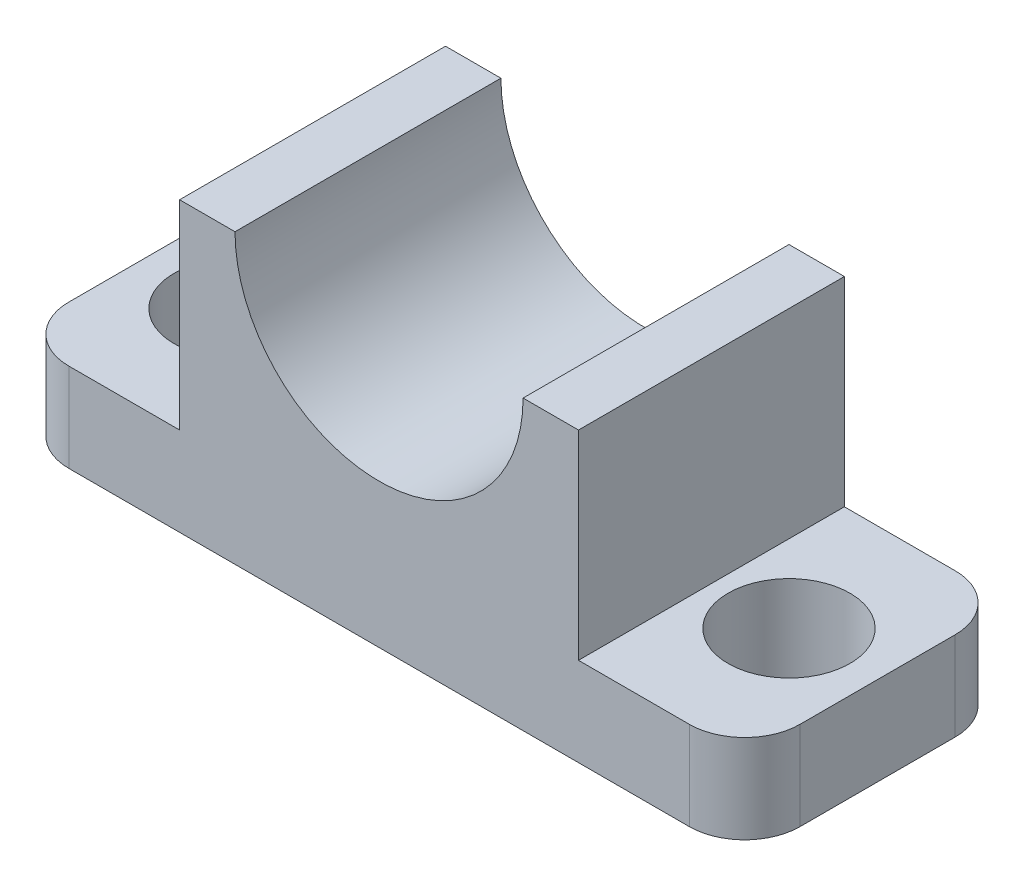
ISO-10303-21;
HEADER;
FILE_DESCRIPTION(('STEP AP214'),'2;1');
FILE_NAME('part.step','',(''),(''),'','','');
FILE_SCHEMA(('AUTOMOTIVE_DESIGN { 1 0 10303 214 1 1 1 1 }'));
ENDSEC;
DATA;
#1=APPLICATION_CONTEXT('core data for automotive mechanical design processes');
#2=APPLICATION_PROTOCOL_DEFINITION('international standard','automotive_design',2000,#1);
#3=PRODUCT_CONTEXT('',#1,'mechanical');
#4=PRODUCT('Part','Part','',(#3));
#5=PRODUCT_RELATED_PRODUCT_CATEGORY('part','',(#4));
#6=PRODUCT_DEFINITION_FORMATION('','',#4);
#7=PRODUCT_DEFINITION_CONTEXT('part definition',#1,'design');
#8=PRODUCT_DEFINITION('design','',#6,#7);
#9=PRODUCT_DEFINITION_SHAPE('','',#8);
#10=(LENGTH_UNIT() NAMED_UNIT(*) SI_UNIT(.MILLI.,.METRE.));
#11=(NAMED_UNIT(*) PLANE_ANGLE_UNIT() SI_UNIT($,.RADIAN.));
#12=(NAMED_UNIT(*) SI_UNIT($,.STERADIAN.) SOLID_ANGLE_UNIT());
#13=UNCERTAINTY_MEASURE_WITH_UNIT(LENGTH_MEASURE(1.E-05),#10,'distance_accuracy_value','');
#14=(GEOMETRIC_REPRESENTATION_CONTEXT(3) GLOBAL_UNCERTAINTY_ASSIGNED_CONTEXT((#13)) GLOBAL_UNIT_ASSIGNED_CONTEXT((#10,
#11,#12)) REPRESENTATION_CONTEXT('',''));
#15=CARTESIAN_POINT('',(0.,0.,0.));
#16=DIRECTION('',(0.,0.,1.));
#17=DIRECTION('',(1.,0.,0.));
#18=AXIS2_PLACEMENT_3D('',#15,#16,#17);
#19=CARTESIAN_POINT('',(18.,26.,12.));
#20=DIRECTION('',(0.,-1.,0.));
#21=DIRECTION('',(0.,0.,-1.));
#22=AXIS2_PLACEMENT_3D('',#19,#20,#21);
#23=PLANE('',#22);
#24=DIRECTION('',(-1.,0.,0.));
#25=VECTOR('',#24,1.);
#26=CARTESIAN_POINT('',(18.,26.,-12.));
#27=LINE('',#26,#25);
#28=CARTESIAN_POINT('',(18.,26.,-12.));
#29=VERTEX_POINT('',#28);
#30=CARTESIAN_POINT('',(13.,26.,-12.));
#31=VERTEX_POINT('',#30);
#32=EDGE_CURVE('E172',#29,#31,#27,.T.);
#33=ORIENTED_EDGE('',*,*,#32,.T.);
#34=DIRECTION('',(0.,0.,-1.));
#35=VECTOR('',#34,1.);
#36=CARTESIAN_POINT('',(13.,26.,12.));
#37=LINE('',#36,#35);
#38=CARTESIAN_POINT('',(13.,26.,12.));
#39=VERTEX_POINT('',#38);
#40=EDGE_CURVE('E150',#39,#31,#37,.T.);
#41=ORIENTED_EDGE('',*,*,#40,.F.);
#42=DIRECTION('',(-1.,0.,0.));
#43=VECTOR('',#42,1.);
#44=CARTESIAN_POINT('',(18.,26.,12.));
#45=LINE('',#44,#43);
#46=CARTESIAN_POINT('',(18.,26.,12.));
#47=VERTEX_POINT('',#46);
#48=EDGE_CURVE('E158',#47,#39,#45,.T.);
#49=ORIENTED_EDGE('',*,*,#48,.F.);
#50=DIRECTION('',(0.,0.,-1.));
#51=VECTOR('',#50,1.);
#52=CARTESIAN_POINT('',(18.,26.,12.));
#53=LINE('',#52,#51);
#54=EDGE_CURVE('E243',#47,#29,#53,.T.);
#55=ORIENTED_EDGE('',*,*,#54,.T.);
#56=EDGE_LOOP('',(#33,#41,#49,#55));
#57=FACE_BOUND('',#56,.T.);
#58=ADVANCED_FACE('F45',(#57),#23,.F.);
#59=CARTESIAN_POINT('',(0.,26.,12.));
#60=DIRECTION('',(0.,0.,-1.));
#61=DIRECTION('',(-1.,0.,0.));
#62=AXIS2_PLACEMENT_3D('',#59,#60,#61);
#63=CYLINDRICAL_SURFACE('',#62,13.);
#64=CARTESIAN_POINT('',(0.,26.,-12.));
#65=DIRECTION('',(0.,0.,-1.));
#66=DIRECTION('',(1.,0.,0.));
#67=AXIS2_PLACEMENT_3D('',#64,#65,#66);
#68=CIRCLE('',#67,13.);
#69=CARTESIAN_POINT('',(-13.,26.,-12.));
#70=VERTEX_POINT('',#69);
#71=EDGE_CURVE('E282',#31,#70,#68,.T.);
#72=ORIENTED_EDGE('',*,*,#71,.T.);
#73=DIRECTION('',(0.,0.,-1.));
#74=VECTOR('',#73,1.);
#75=CARTESIAN_POINT('',(-13.,26.,12.));
#76=LINE('',#75,#74);
#77=CARTESIAN_POINT('',(-13.,26.,12.));
#78=VERTEX_POINT('',#77);
#79=EDGE_CURVE('E153',#78,#70,#76,.T.);
#80=ORIENTED_EDGE('',*,*,#79,.F.);
#81=CARTESIAN_POINT('',(0.,26.,12.));
#82=DIRECTION('',(0.,0.,-1.));
#83=DIRECTION('',(1.,0.,0.));
#84=AXIS2_PLACEMENT_3D('',#81,#82,#83);
#85=CIRCLE('',#84,13.);
#86=EDGE_CURVE('E146',#39,#78,#85,.T.);
#87=ORIENTED_EDGE('',*,*,#86,.F.);
#88=ORIENTED_EDGE('',*,*,#40,.T.);
#89=EDGE_LOOP('',(#72,#80,#87,#88));
#90=FACE_BOUND('',#89,.T.);
#91=ADVANCED_FACE('F148',(#90),#63,.F.);
#92=CARTESIAN_POINT('',(-18.,26.,12.));
#93=DIRECTION('',(0.,-1.,0.));
#94=DIRECTION('',(0.,0.,-1.));
#95=AXIS2_PLACEMENT_3D('',#92,#93,#94);
#96=PLANE('',#95);
#97=DIRECTION('',(-1.,0.,0.));
#98=VECTOR('',#97,1.);
#99=CARTESIAN_POINT('',(-18.,26.,-12.));
#100=LINE('',#99,#98);
#101=CARTESIAN_POINT('',(-18.,26.,-12.));
#102=VERTEX_POINT('',#101);
#103=EDGE_CURVE('E273',#70,#102,#100,.T.);
#104=ORIENTED_EDGE('',*,*,#103,.T.);
#105=DIRECTION('',(0.,0.,-1.));
#106=VECTOR('',#105,1.);
#107=CARTESIAN_POINT('',(-18.,26.,12.));
#108=LINE('',#107,#106);
#109=CARTESIAN_POINT('',(-18.,26.,12.));
#110=VERTEX_POINT('',#109);
#111=EDGE_CURVE('E181',#110,#102,#108,.T.);
#112=ORIENTED_EDGE('',*,*,#111,.F.);
#113=DIRECTION('',(-1.,0.,0.));
#114=VECTOR('',#113,1.);
#115=CARTESIAN_POINT('',(-18.,26.,12.));
#116=LINE('',#115,#114);
#117=EDGE_CURVE('E157',#78,#110,#116,.T.);
#118=ORIENTED_EDGE('',*,*,#117,.F.);
#119=ORIENTED_EDGE('',*,*,#79,.T.);
#120=EDGE_LOOP('',(#104,#112,#118,#119));
#121=FACE_BOUND('',#120,.T.);
#122=ADVANCED_FACE('F305',(#121),#96,.F.);
#123=CARTESIAN_POINT('',(-18.,8.,12.));
#124=DIRECTION('',(1.,0.,0.));
#125=DIRECTION('',(0.,0.,-1.));
#126=AXIS2_PLACEMENT_3D('',#123,#124,#125);
#127=PLANE('',#126);
#128=DIRECTION('',(0.,-1.,0.));
#129=VECTOR('',#128,1.);
#130=CARTESIAN_POINT('',(-18.,8.,-12.));
#131=LINE('',#130,#129);
#132=CARTESIAN_POINT('',(-18.,8.,-12.));
#133=VERTEX_POINT('',#132);
#134=EDGE_CURVE('E265',#102,#133,#131,.T.);
#135=ORIENTED_EDGE('',*,*,#134,.T.);
#136=DIRECTION('',(0.,0.,-1.));
#137=VECTOR('',#136,1.);
#138=CARTESIAN_POINT('',(-18.,8.,12.));
#139=LINE('',#138,#137);
#140=CARTESIAN_POINT('',(-18.,8.,12.));
#141=VERTEX_POINT('',#140);
#142=EDGE_CURVE('E254',#141,#133,#139,.T.);
#143=ORIENTED_EDGE('',*,*,#142,.F.);
#144=DIRECTION('',(0.,-1.,0.));
#145=VECTOR('',#144,1.);
#146=CARTESIAN_POINT('',(-18.,8.,12.));
#147=LINE('',#146,#145);
#148=EDGE_CURVE('E266',#110,#141,#147,.T.);
#149=ORIENTED_EDGE('',*,*,#148,.F.);
#150=ORIENTED_EDGE('',*,*,#111,.T.);
#151=EDGE_LOOP('',(#135,#143,#149,#150));
#152=FACE_BOUND('',#151,.T.);
#153=ADVANCED_FACE('F263',(#152),#127,.F.);
#154=CARTESIAN_POINT('',(-33.,8.,12.));
#155=DIRECTION('',(0.,-1.,0.));
#156=DIRECTION('',(1.,0.,0.));
#157=AXIS2_PLACEMENT_3D('',#154,#155,#156);
#158=PLANE('',#157);
#159=CARTESIAN_POINT('',(-25.,7.99999999999999,0.));
#160=DIRECTION('',(0.,1.,0.));
#161=DIRECTION('',(1.,0.,0.));
#162=AXIS2_PLACEMENT_3D('',#159,#160,#161);
#163=CIRCLE('',#162,5.5);
#164=CARTESIAN_POINT('',(-19.5,7.99999999999999,0.));
#165=VERTEX_POINT('',#164);
#166=EDGE_CURVE('E487',#165,#165,#163,.T.);
#167=ORIENTED_EDGE('',*,*,#166,.F.);
#168=EDGE_LOOP('',(#167));
#169=FACE_BOUND('',#168,.T.);
#170=DIRECTION('',(0.,0.,-1.));
#171=VECTOR('',#170,1.);
#172=CARTESIAN_POINT('',(-33.,8.,12.));
#173=LINE('',#172,#171);
#174=CARTESIAN_POINT('',(-33.,8.,7.));
#175=VERTEX_POINT('',#174);
#176=CARTESIAN_POINT('',(-33.,8.,-7.));
#177=VERTEX_POINT('',#176);
#178=EDGE_CURVE('E250',#175,#177,#173,.T.);
#179=ORIENTED_EDGE('',*,*,#178,.F.);
#180=CARTESIAN_POINT('',(-28.,8.,7.));
#181=DIRECTION('',(0.,-1.,0.));
#182=DIRECTION('',(1.,0.,0.));
#183=AXIS2_PLACEMENT_3D('',#180,#181,#182);
#184=CIRCLE('',#183,5.);
#185=CARTESIAN_POINT('',(-28.,8.,12.));
#186=VERTEX_POINT('',#185);
#187=EDGE_CURVE('E210',#175,#186,#184,.F.);
#188=ORIENTED_EDGE('',*,*,#187,.T.);
#189=DIRECTION('',(-1.,0.,0.));
#190=VECTOR('',#189,1.);
#191=CARTESIAN_POINT('',(-33.,8.,12.));
#192=LINE('',#191,#190);
#193=EDGE_CURVE('E309',#141,#186,#192,.T.);
#194=ORIENTED_EDGE('',*,*,#193,.F.);
#195=ORIENTED_EDGE('',*,*,#142,.T.);
#196=DIRECTION('',(-1.,0.,0.));
#197=VECTOR('',#196,1.);
#198=CARTESIAN_POINT('',(-33.,8.,-12.));
#199=LINE('',#198,#197);
#200=CARTESIAN_POINT('',(-28.,8.,-12.));
#201=VERTEX_POINT('',#200);
#202=EDGE_CURVE('E275',#133,#201,#199,.T.);
#203=ORIENTED_EDGE('',*,*,#202,.T.);
#204=CARTESIAN_POINT('',(-28.,8.,-7.));
#205=DIRECTION('',(0.,-1.,0.));
#206=DIRECTION('',(1.,0.,0.));
#207=AXIS2_PLACEMENT_3D('',#204,#205,#206);
#208=CIRCLE('',#207,5.);
#209=EDGE_CURVE('E207',#201,#177,#208,.F.);
#210=ORIENTED_EDGE('',*,*,#209,.T.);
#211=EDGE_LOOP('',(#179,#188,#194,#195,#203,#210));
#212=FACE_BOUND('',#211,.T.);
#213=ADVANCED_FACE('F448',(#169,#212),#158,.F.);
#214=CARTESIAN_POINT('',(-33.,0.,12.));
#215=DIRECTION('',(1.,0.,0.));
#216=DIRECTION('',(0.,0.,-1.));
#217=AXIS2_PLACEMENT_3D('',#214,#215,#216);
#218=PLANE('',#217);
#219=DIRECTION('',(0.,0.,-1.));
#220=VECTOR('',#219,1.);
#221=CARTESIAN_POINT('',(-33.,0.,12.));
#222=LINE('',#221,#220);
#223=CARTESIAN_POINT('',(-33.,0.,7.));
#224=VERTEX_POINT('',#223);
#225=CARTESIAN_POINT('',(-33.,0.,-7.));
#226=VERTEX_POINT('',#225);
#227=EDGE_CURVE('E240',#224,#226,#222,.T.);
#228=ORIENTED_EDGE('',*,*,#227,.F.);
#229=DIRECTION('',(0.,-1.,0.));
#230=VECTOR('',#229,1.);
#231=CARTESIAN_POINT('',(-33.,8.,7.));
#232=LINE('',#231,#230);
#233=EDGE_CURVE('E204',#224,#175,#232,.F.);
#234=ORIENTED_EDGE('',*,*,#233,.T.);
#235=ORIENTED_EDGE('',*,*,#178,.T.);
#236=DIRECTION('',(0.,-1.,0.));
#237=VECTOR('',#236,1.);
#238=CARTESIAN_POINT('',(-33.,0.,-7.));
#239=LINE('',#238,#237);
#240=EDGE_CURVE('E200',#177,#226,#239,.T.);
#241=ORIENTED_EDGE('',*,*,#240,.T.);
#242=EDGE_LOOP('',(#228,#234,#235,#241));
#243=FACE_BOUND('',#242,.T.);
#244=ADVANCED_FACE('F438',(#243),#218,.F.);
#245=CARTESIAN_POINT('',(-33.,0.,12.));
#246=DIRECTION('',(0.,1.,0.));
#247=DIRECTION('',(0.,0.,1.));
#248=AXIS2_PLACEMENT_3D('',#245,#246,#247);
#249=PLANE('',#248);
#250=CARTESIAN_POINT('',(25.,0.,0.));
#251=DIRECTION('',(0.,1.,0.));
#252=DIRECTION('',(-1.,0.,0.));
#253=AXIS2_PLACEMENT_3D('',#250,#251,#252);
#254=CIRCLE('',#253,5.5);
#255=CARTESIAN_POINT('',(19.5,0.,0.));
#256=VERTEX_POINT('',#255);
#257=EDGE_CURVE('E303',#256,#256,#254,.T.);
#258=ORIENTED_EDGE('',*,*,#257,.T.);
#259=EDGE_LOOP('',(#258));
#260=FACE_BOUND('',#259,.T.);
#261=CARTESIAN_POINT('',(-25.,0.,0.));
#262=DIRECTION('',(0.,1.,0.));
#263=DIRECTION('',(1.,0.,0.));
#264=AXIS2_PLACEMENT_3D('',#261,#262,#263);
#265=CIRCLE('',#264,5.5);
#266=CARTESIAN_POINT('',(-19.5,0.,0.));
#267=VERTEX_POINT('',#266);
#268=EDGE_CURVE('E498',#267,#267,#265,.T.);
#269=ORIENTED_EDGE('',*,*,#268,.T.);
#270=EDGE_LOOP('',(#269));
#271=FACE_BOUND('',#270,.T.);
#272=DIRECTION('',(1.,0.,0.));
#273=VECTOR('',#272,1.);
#274=CARTESIAN_POINT('',(-33.,0.,12.));
#275=LINE('',#274,#273);
#276=CARTESIAN_POINT('',(-28.,0.,12.));
#277=VERTEX_POINT('',#276);
#278=CARTESIAN_POINT('',(28.,0.,12.));
#279=VERTEX_POINT('',#278);
#280=EDGE_CURVE('E298',#277,#279,#275,.T.);
#281=ORIENTED_EDGE('',*,*,#280,.F.);
#282=CARTESIAN_POINT('',(-28.,0.,7.));
#283=DIRECTION('',(0.,1.,0.));
#284=DIRECTION('',(0.,0.,1.));
#285=AXIS2_PLACEMENT_3D('',#282,#283,#284);
#286=CIRCLE('',#285,5.);
#287=EDGE_CURVE('E197',#277,#224,#286,.F.);
#288=ORIENTED_EDGE('',*,*,#287,.T.);
#289=ORIENTED_EDGE('',*,*,#227,.T.);
#290=CARTESIAN_POINT('',(-28.,0.,-7.));
#291=DIRECTION('',(0.,1.,0.));
#292=DIRECTION('',(0.,0.,1.));
#293=AXIS2_PLACEMENT_3D('',#290,#291,#292);
#294=CIRCLE('',#293,5.);
#295=CARTESIAN_POINT('',(-28.,0.,-12.));
#296=VERTEX_POINT('',#295);
#297=EDGE_CURVE('E194',#226,#296,#294,.F.);
#298=ORIENTED_EDGE('',*,*,#297,.T.);
#299=DIRECTION('',(1.,0.,0.));
#300=VECTOR('',#299,1.);
#301=CARTESIAN_POINT('',(-33.,0.,-12.));
#302=LINE('',#301,#300);
#303=CARTESIAN_POINT('',(28.,0.,-12.));
#304=VERTEX_POINT('',#303);
#305=EDGE_CURVE('E280',#296,#304,#302,.T.);
#306=ORIENTED_EDGE('',*,*,#305,.T.);
#307=CARTESIAN_POINT('',(28.,0.,-7.));
#308=DIRECTION('',(0.,1.,0.));
#309=DIRECTION('',(0.,0.,1.));
#310=AXIS2_PLACEMENT_3D('',#307,#308,#309);
#311=CIRCLE('',#310,5.);
#312=CARTESIAN_POINT('',(33.,0.,-7.));
#313=VERTEX_POINT('',#312);
#314=EDGE_CURVE('E191',#304,#313,#311,.F.);
#315=ORIENTED_EDGE('',*,*,#314,.T.);
#316=DIRECTION('',(0.,0.,-1.));
#317=VECTOR('',#316,1.);
#318=CARTESIAN_POINT('',(33.,0.,12.));
#319=LINE('',#318,#317);
#320=CARTESIAN_POINT('',(33.,0.,7.));
#321=VERTEX_POINT('',#320);
#322=EDGE_CURVE('E231',#321,#313,#319,.T.);
#323=ORIENTED_EDGE('',*,*,#322,.F.);
#324=CARTESIAN_POINT('',(28.,0.,7.));
#325=DIRECTION('',(0.,1.,0.));
#326=DIRECTION('',(0.,0.,1.));
#327=AXIS2_PLACEMENT_3D('',#324,#325,#326);
#328=CIRCLE('',#327,5.);
#329=EDGE_CURVE('E188',#321,#279,#328,.F.);
#330=ORIENTED_EDGE('',*,*,#329,.T.);
#331=EDGE_LOOP('',(#281,#288,#289,#298,#306,#315,#323,#330));
#332=FACE_BOUND('',#331,.T.);
#333=ADVANCED_FACE('F321',(#260,#271,#332),#249,.F.);
#334=CARTESIAN_POINT('',(33.,0.,12.));
#335=DIRECTION('',(-1.,0.,0.));
#336=DIRECTION('',(0.,0.,1.));
#337=AXIS2_PLACEMENT_3D('',#334,#335,#336);
#338=PLANE('',#337);
#339=ORIENTED_EDGE('',*,*,#322,.T.);
#340=DIRECTION('',(0.,1.,0.));
#341=VECTOR('',#340,1.);
#342=CARTESIAN_POINT('',(33.,0.,-7.));
#343=LINE('',#342,#341);
#344=CARTESIAN_POINT('',(33.,8.,-7.));
#345=VERTEX_POINT('',#344);
#346=EDGE_CURVE('E222',#313,#345,#343,.T.);
#347=ORIENTED_EDGE('',*,*,#346,.T.);
#348=DIRECTION('',(0.,0.,-1.));
#349=VECTOR('',#348,1.);
#350=CARTESIAN_POINT('',(33.,8.,12.));
#351=LINE('',#350,#349);
#352=CARTESIAN_POINT('',(33.,8.,7.));
#353=VERTEX_POINT('',#352);
#354=EDGE_CURVE('E228',#353,#345,#351,.T.);
#355=ORIENTED_EDGE('',*,*,#354,.F.);
#356=DIRECTION('',(0.,1.,0.));
#357=VECTOR('',#356,1.);
#358=CARTESIAN_POINT('',(33.,0.,7.));
#359=LINE('',#358,#357);
#360=EDGE_CURVE('E219',#353,#321,#359,.F.);
#361=ORIENTED_EDGE('',*,*,#360,.T.);
#362=EDGE_LOOP('',(#339,#347,#355,#361));
#363=FACE_BOUND('',#362,.T.);
#364=ADVANCED_FACE('F227',(#363),#338,.F.);
#365=CARTESIAN_POINT('',(33.,8.,12.));
#366=DIRECTION('',(0.,-1.,0.));
#367=DIRECTION('',(1.,0.,0.));
#368=AXIS2_PLACEMENT_3D('',#365,#366,#367);
#369=PLANE('',#368);
#370=CARTESIAN_POINT('',(25.,8.,0.));
#371=DIRECTION('',(0.,1.,0.));
#372=DIRECTION('',(-1.,0.,0.));
#373=AXIS2_PLACEMENT_3D('',#370,#371,#372);
#374=CIRCLE('',#373,5.5);
#375=CARTESIAN_POINT('',(19.5,8.,0.));
#376=VERTEX_POINT('',#375);
#377=EDGE_CURVE('E497',#376,#376,#374,.T.);
#378=ORIENTED_EDGE('',*,*,#377,.F.);
#379=EDGE_LOOP('',(#378));
#380=FACE_BOUND('',#379,.T.);
#381=ORIENTED_EDGE('',*,*,#354,.T.);
#382=CARTESIAN_POINT('',(28.,8.,-7.));
#383=DIRECTION('',(0.,-1.,0.));
#384=DIRECTION('',(1.,0.,0.));
#385=AXIS2_PLACEMENT_3D('',#382,#383,#384);
#386=CIRCLE('',#385,5.);
#387=CARTESIAN_POINT('',(28.,8.,-12.));
#388=VERTEX_POINT('',#387);
#389=EDGE_CURVE('E11',#345,#388,#386,.F.);
#390=ORIENTED_EDGE('',*,*,#389,.T.);
#391=DIRECTION('',(-1.,0.,0.));
#392=VECTOR('',#391,1.);
#393=CARTESIAN_POINT('',(33.,8.,-12.));
#394=LINE('',#393,#392);
#395=CARTESIAN_POINT('',(18.,8.,-12.));
#396=VERTEX_POINT('',#395);
#397=EDGE_CURVE('E289',#388,#396,#394,.T.);
#398=ORIENTED_EDGE('',*,*,#397,.T.);
#399=DIRECTION('',(0.,0.,-1.));
#400=VECTOR('',#399,1.);
#401=CARTESIAN_POINT('',(18.,8.,12.));
#402=LINE('',#401,#400);
#403=CARTESIAN_POINT('',(18.,8.,12.));
#404=VERTEX_POINT('',#403);
#405=EDGE_CURVE('E236',#404,#396,#402,.T.);
#406=ORIENTED_EDGE('',*,*,#405,.F.);
#407=DIRECTION('',(-1.,0.,0.));
#408=VECTOR('',#407,1.);
#409=CARTESIAN_POINT('',(33.,8.,12.));
#410=LINE('',#409,#408);
#411=CARTESIAN_POINT('',(28.,8.,12.));
#412=VERTEX_POINT('',#411);
#413=EDGE_CURVE('E295',#412,#404,#410,.T.);
#414=ORIENTED_EDGE('',*,*,#413,.F.);
#415=CARTESIAN_POINT('',(28.,8.,7.));
#416=DIRECTION('',(0.,-1.,0.));
#417=DIRECTION('',(1.,0.,0.));
#418=AXIS2_PLACEMENT_3D('',#415,#416,#417);
#419=CIRCLE('',#418,5.);
#420=EDGE_CURVE('E54',#412,#353,#419,.F.);
#421=ORIENTED_EDGE('',*,*,#420,.T.);
#422=EDGE_LOOP('',(#381,#390,#398,#406,#414,#421));
#423=FACE_BOUND('',#422,.T.);
#424=ADVANCED_FACE('F233',(#380,#423),#369,.F.);
#425=CARTESIAN_POINT('',(18.,8.,12.));
#426=DIRECTION('',(-1.,0.,0.));
#427=DIRECTION('',(0.,0.,1.));
#428=AXIS2_PLACEMENT_3D('',#425,#426,#427);
#429=PLANE('',#428);
#430=DIRECTION('',(0.,1.,0.));
#431=VECTOR('',#430,1.);
#432=CARTESIAN_POINT('',(18.,8.,-12.));
#433=LINE('',#432,#431);
#434=EDGE_CURVE('E169',#396,#29,#433,.T.);
#435=ORIENTED_EDGE('',*,*,#434,.T.);
#436=ORIENTED_EDGE('',*,*,#54,.F.);
#437=DIRECTION('',(0.,1.,0.));
#438=VECTOR('',#437,1.);
#439=CARTESIAN_POINT('',(18.,8.,12.));
#440=LINE('',#439,#438);
#441=EDGE_CURVE('E164',#404,#47,#440,.T.);
#442=ORIENTED_EDGE('',*,*,#441,.F.);
#443=ORIENTED_EDGE('',*,*,#405,.T.);
#444=EDGE_LOOP('',(#435,#436,#442,#443));
#445=FACE_BOUND('',#444,.T.);
#446=ADVANCED_FACE('F327',(#445),#429,.F.);
#447=CARTESIAN_POINT('',(0.,26.,12.));
#448=DIRECTION('',(0.,0.,1.));
#449=DIRECTION('',(1.,0.,0.));
#450=AXIS2_PLACEMENT_3D('',#447,#448,#449);
#451=PLANE('',#450);
#452=ORIENTED_EDGE('',*,*,#193,.T.);
#453=DIRECTION('',(0.,-1.,0.));
#454=VECTOR('',#453,1.);
#455=CARTESIAN_POINT('',(-28.,0.,12.));
#456=LINE('',#455,#454);
#457=EDGE_CURVE('E179',#186,#277,#456,.T.);
#458=ORIENTED_EDGE('',*,*,#457,.T.);
#459=ORIENTED_EDGE('',*,*,#280,.T.);
#460=DIRECTION('',(0.,1.,0.));
#461=VECTOR('',#460,1.);
#462=CARTESIAN_POINT('',(28.,8.,12.));
#463=LINE('',#462,#461);
#464=EDGE_CURVE('E174',#279,#412,#463,.T.);
#465=ORIENTED_EDGE('',*,*,#464,.T.);
#466=ORIENTED_EDGE('',*,*,#413,.T.);
#467=ORIENTED_EDGE('',*,*,#441,.T.);
#468=ORIENTED_EDGE('',*,*,#48,.T.);
#469=ORIENTED_EDGE('',*,*,#86,.T.);
#470=ORIENTED_EDGE('',*,*,#117,.T.);
#471=ORIENTED_EDGE('',*,*,#148,.T.);
#472=EDGE_LOOP('',(#452,#458,#459,#465,#466,#467,#468,#469,#470,#471));
#473=FACE_BOUND('',#472,.T.);
#474=ADVANCED_FACE('F162',(#473),#451,.T.);
#475=CARTESIAN_POINT('',(0.,26.,-12.));
#476=DIRECTION('',(0.,0.,1.));
#477=DIRECTION('',(1.,0.,0.));
#478=AXIS2_PLACEMENT_3D('',#475,#476,#477);
#479=PLANE('',#478);
#480=ORIENTED_EDGE('',*,*,#305,.F.);
#481=DIRECTION('',(0.,-1.,0.));
#482=VECTOR('',#481,1.);
#483=CARTESIAN_POINT('',(-28.,26.,-12.));
#484=LINE('',#483,#482);
#485=EDGE_CURVE('E216',#296,#201,#484,.F.);
#486=ORIENTED_EDGE('',*,*,#485,.T.);
#487=ORIENTED_EDGE('',*,*,#202,.F.);
#488=ORIENTED_EDGE('',*,*,#134,.F.);
#489=ORIENTED_EDGE('',*,*,#103,.F.);
#490=ORIENTED_EDGE('',*,*,#71,.F.);
#491=ORIENTED_EDGE('',*,*,#32,.F.);
#492=ORIENTED_EDGE('',*,*,#434,.F.);
#493=ORIENTED_EDGE('',*,*,#397,.F.);
#494=DIRECTION('',(0.,1.,0.));
#495=VECTOR('',#494,1.);
#496=CARTESIAN_POINT('',(28.,26.,-12.));
#497=LINE('',#496,#495);
#498=EDGE_CURVE('E213',#388,#304,#497,.F.);
#499=ORIENTED_EDGE('',*,*,#498,.T.);
#500=EDGE_LOOP('',(#480,#486,#487,#488,#489,#490,#491,#492,#493,#499));
#501=FACE_BOUND('',#500,.T.);
#502=ADVANCED_FACE('F272',(#501),#479,.F.);
#503=CARTESIAN_POINT('',(25.,0.,0.));
#504=DIRECTION('',(0.,1.,0.));
#505=DIRECTION('',(-1.,0.,0.));
#506=AXIS2_PLACEMENT_3D('',#503,#504,#505);
#507=CYLINDRICAL_SURFACE('',#506,5.5);
#508=ORIENTED_EDGE('',*,*,#257,.F.);
#509=EDGE_LOOP('',(#508));
#510=FACE_BOUND('',#509,.T.);
#511=ORIENTED_EDGE('',*,*,#377,.T.);
#512=EDGE_LOOP('',(#511));
#513=FACE_BOUND('',#512,.T.);
#514=ADVANCED_FACE('F389',(#510,#513),#507,.F.);
#515=CARTESIAN_POINT('',(-25.,0.,0.));
#516=DIRECTION('',(0.,1.,0.));
#517=DIRECTION('',(-1.,0.,0.));
#518=AXIS2_PLACEMENT_3D('',#515,#516,#517);
#519=CYLINDRICAL_SURFACE('',#518,5.5);
#520=ORIENTED_EDGE('',*,*,#268,.F.);
#521=EDGE_LOOP('',(#520));
#522=FACE_BOUND('',#521,.T.);
#523=ORIENTED_EDGE('',*,*,#166,.T.);
#524=EDGE_LOOP('',(#523));
#525=FACE_BOUND('',#524,.T.);
#526=ADVANCED_FACE('F352',(#522,#525),#519,.F.);
#527=CARTESIAN_POINT('',(-28.,26.,7.));
#528=DIRECTION('',(0.,1.,0.));
#529=DIRECTION('',(0.,0.,1.));
#530=AXIS2_PLACEMENT_3D('',#527,#528,#529);
#531=CYLINDRICAL_SURFACE('',#530,5.);
#532=ORIENTED_EDGE('',*,*,#187,.F.);
#533=ORIENTED_EDGE('',*,*,#233,.F.);
#534=ORIENTED_EDGE('',*,*,#287,.F.);
#535=ORIENTED_EDGE('',*,*,#457,.F.);
#536=EDGE_LOOP('',(#532,#533,#534,#535));
#537=FACE_BOUND('',#536,.T.);
#538=ADVANCED_FACE('F348',(#537),#531,.T.);
#539=CARTESIAN_POINT('',(-28.,0.,-7.));
#540=DIRECTION('',(0.,-1.,0.));
#541=DIRECTION('',(0.,0.,-1.));
#542=AXIS2_PLACEMENT_3D('',#539,#540,#541);
#543=CYLINDRICAL_SURFACE('',#542,5.);
#544=ORIENTED_EDGE('',*,*,#209,.F.);
#545=ORIENTED_EDGE('',*,*,#485,.F.);
#546=ORIENTED_EDGE('',*,*,#297,.F.);
#547=ORIENTED_EDGE('',*,*,#240,.F.);
#548=EDGE_LOOP('',(#544,#545,#546,#547));
#549=FACE_BOUND('',#548,.T.);
#550=ADVANCED_FACE('F351',(#549),#543,.T.);
#551=CARTESIAN_POINT('',(28.,0.,-7.));
#552=DIRECTION('',(0.,1.,0.));
#553=DIRECTION('',(0.,0.,1.));
#554=AXIS2_PLACEMENT_3D('',#551,#552,#553);
#555=CYLINDRICAL_SURFACE('',#554,5.);
#556=ORIENTED_EDGE('',*,*,#314,.F.);
#557=ORIENTED_EDGE('',*,*,#498,.F.);
#558=ORIENTED_EDGE('',*,*,#389,.F.);
#559=ORIENTED_EDGE('',*,*,#346,.F.);
#560=EDGE_LOOP('',(#556,#557,#558,#559));
#561=FACE_BOUND('',#560,.T.);
#562=ADVANCED_FACE('F322',(#561),#555,.T.);
#563=CARTESIAN_POINT('',(28.,26.,7.));
#564=DIRECTION('',(0.,-1.,0.));
#565=DIRECTION('',(0.,0.,-1.));
#566=AXIS2_PLACEMENT_3D('',#563,#564,#565);
#567=CYLINDRICAL_SURFACE('',#566,5.);
#568=ORIENTED_EDGE('',*,*,#329,.F.);
#569=ORIENTED_EDGE('',*,*,#360,.F.);
#570=ORIENTED_EDGE('',*,*,#420,.F.);
#571=ORIENTED_EDGE('',*,*,#464,.F.);
#572=EDGE_LOOP('',(#568,#569,#570,#571));
#573=FACE_BOUND('',#572,.T.);
#574=ADVANCED_FACE('F47',(#573),#567,.T.);
#575=CLOSED_SHELL('',(#58,#91,#122,#153,#213,#244,#333,#364,#424,#446,#474,#502,#514,#526,#538,
#550,#562,#574));
#576=MANIFOLD_SOLID_BREP('B2',#575);
#577=ADVANCED_BREP_SHAPE_REPRESENTATION('',(#18,#576),#14);
#578=SHAPE_DEFINITION_REPRESENTATION(#9,#577);
ENDSEC;
END-ISO-10303-21;
